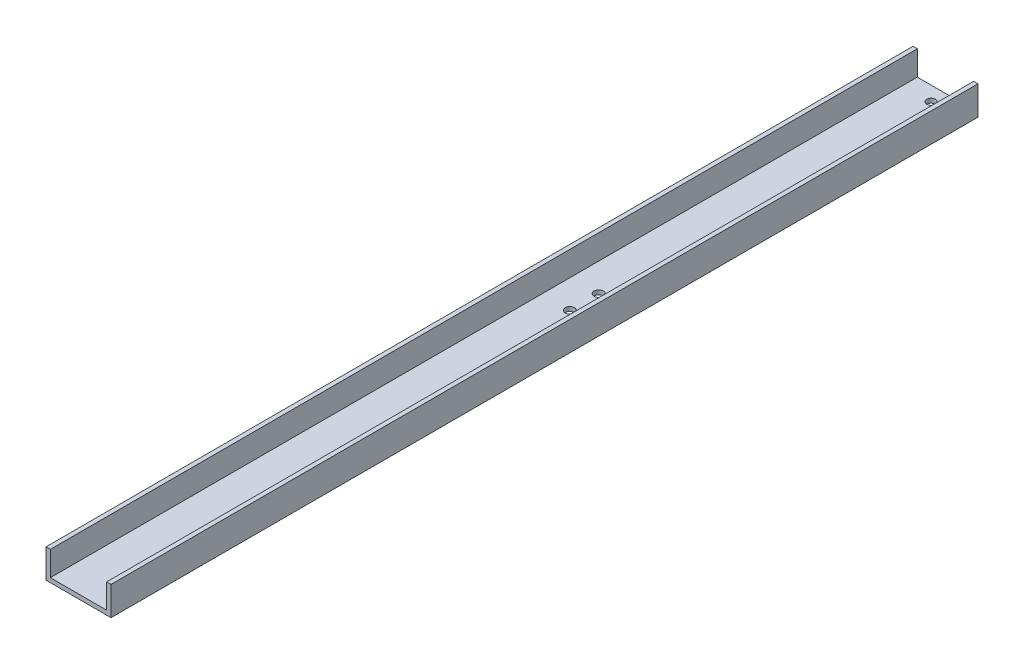
ISO-10303-21;
HEADER;
FILE_DESCRIPTION(('STEP AP214'),'2;1');
FILE_NAME('part.step','',(''),(''),'','','');
FILE_SCHEMA(('AUTOMOTIVE_DESIGN { 1 0 10303 214 1 1 1 1 }'));
ENDSEC;
DATA;
#1=APPLICATION_CONTEXT('core data for automotive mechanical design processes');
#2=APPLICATION_PROTOCOL_DEFINITION('international standard','automotive_design',2000,#1);
#3=PRODUCT_CONTEXT('',#1,'mechanical');
#4=PRODUCT('Part','Part','',(#3));
#5=PRODUCT_RELATED_PRODUCT_CATEGORY('part','',(#4));
#6=PRODUCT_DEFINITION_FORMATION('','',#4);
#7=PRODUCT_DEFINITION_CONTEXT('part definition',#1,'design');
#8=PRODUCT_DEFINITION('design','',#6,#7);
#9=PRODUCT_DEFINITION_SHAPE('','',#8);
#10=(LENGTH_UNIT() NAMED_UNIT(*) SI_UNIT(.MILLI.,.METRE.));
#11=(NAMED_UNIT(*) PLANE_ANGLE_UNIT() SI_UNIT($,.RADIAN.));
#12=(NAMED_UNIT(*) SI_UNIT($,.STERADIAN.) SOLID_ANGLE_UNIT());
#13=UNCERTAINTY_MEASURE_WITH_UNIT(LENGTH_MEASURE(1.E-05),#10,'distance_accuracy_value','');
#14=(GEOMETRIC_REPRESENTATION_CONTEXT(3) GLOBAL_UNCERTAINTY_ASSIGNED_CONTEXT((#13)) GLOBAL_UNIT_ASSIGNED_CONTEXT((#10,
#11,#12)) REPRESENTATION_CONTEXT('',''));
#15=CARTESIAN_POINT('',(0.,0.,0.));
#16=DIRECTION('',(0.,0.,1.));
#17=DIRECTION('',(1.,0.,0.));
#18=AXIS2_PLACEMENT_3D('',#15,#16,#17);
#19=CARTESIAN_POINT('',(-11.25,10.,300.));
#20=DIRECTION('',(1.,0.,0.));
#21=DIRECTION('',(0.,1.,0.));
#22=AXIS2_PLACEMENT_3D('',#19,#20,#21);
#23=PLANE('',#22);
#24=DIRECTION('',(0.,-1.,0.));
#25=VECTOR('',#24,1.);
#26=CARTESIAN_POINT('',(-11.25,10.,0.));
#27=LINE('',#26,#25);
#28=CARTESIAN_POINT('',(-11.25,10.,0.));
#29=VERTEX_POINT('',#28);
#30=CARTESIAN_POINT('',(-11.25,0.,0.));
#31=VERTEX_POINT('',#30);
#32=EDGE_CURVE('E132',#29,#31,#27,.T.);
#33=ORIENTED_EDGE('',*,*,#32,.T.);
#34=DIRECTION('',(0.,0.,-1.));
#35=VECTOR('',#34,1.);
#36=CARTESIAN_POINT('',(-11.25,0.,300.));
#37=LINE('',#36,#35);
#38=CARTESIAN_POINT('',(-11.25,0.,300.));
#39=VERTEX_POINT('',#38);
#40=EDGE_CURVE('E11',#39,#31,#37,.T.);
#41=ORIENTED_EDGE('',*,*,#40,.F.);
#42=DIRECTION('',(0.,-1.,0.));
#43=VECTOR('',#42,1.);
#44=CARTESIAN_POINT('',(-11.25,10.,300.));
#45=LINE('',#44,#43);
#46=CARTESIAN_POINT('',(-11.25,10.,300.));
#47=VERTEX_POINT('',#46);
#48=EDGE_CURVE('E147',#47,#39,#45,.T.);
#49=ORIENTED_EDGE('',*,*,#48,.F.);
#50=DIRECTION('',(0.,0.,-1.));
#51=VECTOR('',#50,1.);
#52=CARTESIAN_POINT('',(-11.25,10.,300.));
#53=LINE('',#52,#51);
#54=EDGE_CURVE('E128',#47,#29,#53,.T.);
#55=ORIENTED_EDGE('',*,*,#54,.T.);
#56=EDGE_LOOP('',(#33,#41,#49,#55));
#57=FACE_BOUND('',#56,.T.);
#58=ADVANCED_FACE('F34',(#57),#23,.F.);
#59=CARTESIAN_POINT('',(-11.25,0.,300.));
#60=DIRECTION('',(0.,1.,0.));
#61=DIRECTION('',(0.,0.,1.));
#62=AXIS2_PLACEMENT_3D('',#59,#60,#61);
#63=PLANE('',#62);
#64=CARTESIAN_POINT('',(0.,0.,5.));
#65=DIRECTION('',(0.,-1.,0.));
#66=DIRECTION('',(0.,0.,-1.));
#67=AXIS2_PLACEMENT_3D('',#64,#65,#66);
#68=CIRCLE('',#67,1.49999999999999);
#69=CARTESIAN_POINT('',(0.,0.,3.50000000000001));
#70=VERTEX_POINT('',#69);
#71=EDGE_CURVE('E316',#70,#70,#68,.T.);
#72=ORIENTED_EDGE('',*,*,#71,.F.);
#73=EDGE_LOOP('',(#72));
#74=FACE_BOUND('',#73,.T.);
#75=CARTESIAN_POINT('',(0.,0.,130.));
#76=DIRECTION('',(0.,-1.,0.));
#77=DIRECTION('',(0.,0.,-1.));
#78=AXIS2_PLACEMENT_3D('',#75,#76,#77);
#79=CIRCLE('',#78,1.6);
#80=CARTESIAN_POINT('',(0.,0.,128.4));
#81=VERTEX_POINT('',#80);
#82=EDGE_CURVE('E167',#81,#81,#79,.T.);
#83=ORIENTED_EDGE('',*,*,#82,.F.);
#84=EDGE_LOOP('',(#83));
#85=FACE_BOUND('',#84,.T.);
#86=CARTESIAN_POINT('',(0.,0.,120.));
#87=DIRECTION('',(0.,-1.,0.));
#88=DIRECTION('',(0.,0.,-1.));
#89=AXIS2_PLACEMENT_3D('',#86,#87,#88);
#90=CIRCLE('',#89,1.6);
#91=CARTESIAN_POINT('',(0.,0.,118.4));
#92=VERTEX_POINT('',#91);
#93=EDGE_CURVE('E159',#92,#92,#90,.T.);
#94=ORIENTED_EDGE('',*,*,#93,.F.);
#95=EDGE_LOOP('',(#94));
#96=FACE_BOUND('',#95,.T.);
#97=DIRECTION('',(1.,0.,0.));
#98=VECTOR('',#97,1.);
#99=CARTESIAN_POINT('',(-11.25,0.,0.));
#100=LINE('',#99,#98);
#101=CARTESIAN_POINT('',(11.25,0.,0.));
#102=VERTEX_POINT('',#101);
#103=EDGE_CURVE('E135',#31,#102,#100,.T.);
#104=ORIENTED_EDGE('',*,*,#103,.T.);
#105=DIRECTION('',(0.,0.,-1.));
#106=VECTOR('',#105,1.);
#107=CARTESIAN_POINT('',(11.25,0.,300.));
#108=LINE('',#107,#106);
#109=CARTESIAN_POINT('',(11.25,0.,300.));
#110=VERTEX_POINT('',#109);
#111=EDGE_CURVE('E43',#110,#102,#108,.T.);
#112=ORIENTED_EDGE('',*,*,#111,.F.);
#113=DIRECTION('',(1.,0.,0.));
#114=VECTOR('',#113,1.);
#115=CARTESIAN_POINT('',(-11.25,0.,300.));
#116=LINE('',#115,#114);
#117=EDGE_CURVE('E95',#39,#110,#116,.T.);
#118=ORIENTED_EDGE('',*,*,#117,.F.);
#119=ORIENTED_EDGE('',*,*,#40,.T.);
#120=EDGE_LOOP('',(#104,#112,#118,#119));
#121=FACE_BOUND('',#120,.T.);
#122=ADVANCED_FACE('F204',(#74,#85,#96,#121),#63,.F.);
#123=CARTESIAN_POINT('',(11.25,0.,300.));
#124=DIRECTION('',(-1.,0.,0.));
#125=DIRECTION('',(0.,-1.,0.));
#126=AXIS2_PLACEMENT_3D('',#123,#124,#125);
#127=PLANE('',#126);
#128=DIRECTION('',(0.,1.,0.));
#129=VECTOR('',#128,1.);
#130=CARTESIAN_POINT('',(11.25,0.,0.));
#131=LINE('',#130,#129);
#132=CARTESIAN_POINT('',(11.25,10.,0.));
#133=VERTEX_POINT('',#132);
#134=EDGE_CURVE('E138',#102,#133,#131,.T.);
#135=ORIENTED_EDGE('',*,*,#134,.T.);
#136=DIRECTION('',(0.,0.,-1.));
#137=VECTOR('',#136,1.);
#138=CARTESIAN_POINT('',(11.25,10.,300.));
#139=LINE('',#138,#137);
#140=CARTESIAN_POINT('',(11.25,10.,300.));
#141=VERTEX_POINT('',#140);
#142=EDGE_CURVE('E154',#141,#133,#139,.T.);
#143=ORIENTED_EDGE('',*,*,#142,.F.);
#144=DIRECTION('',(0.,1.,0.));
#145=VECTOR('',#144,1.);
#146=CARTESIAN_POINT('',(11.25,0.,300.));
#147=LINE('',#146,#145);
#148=EDGE_CURVE('E173',#110,#141,#147,.T.);
#149=ORIENTED_EDGE('',*,*,#148,.F.);
#150=ORIENTED_EDGE('',*,*,#111,.T.);
#151=EDGE_LOOP('',(#135,#143,#149,#150));
#152=FACE_BOUND('',#151,.T.);
#153=ADVANCED_FACE('F208',(#152),#127,.F.);
#154=CARTESIAN_POINT('',(11.25,10.,300.));
#155=DIRECTION('',(0.,-1.,0.));
#156=DIRECTION('',(0.,0.,-1.));
#157=AXIS2_PLACEMENT_3D('',#154,#155,#156);
#158=PLANE('',#157);
#159=DIRECTION('',(-1.,0.,0.));
#160=VECTOR('',#159,1.);
#161=CARTESIAN_POINT('',(11.25,10.,0.));
#162=LINE('',#161,#160);
#163=CARTESIAN_POINT('',(9.75,10.,0.));
#164=VERTEX_POINT('',#163);
#165=EDGE_CURVE('E140',#133,#164,#162,.T.);
#166=ORIENTED_EDGE('',*,*,#165,.T.);
#167=DIRECTION('',(0.,0.,-1.));
#168=VECTOR('',#167,1.);
#169=CARTESIAN_POINT('',(9.75,10.,300.));
#170=LINE('',#169,#168);
#171=CARTESIAN_POINT('',(9.75,10.,300.));
#172=VERTEX_POINT('',#171);
#173=EDGE_CURVE('E151',#172,#164,#170,.T.);
#174=ORIENTED_EDGE('',*,*,#173,.F.);
#175=DIRECTION('',(-1.,0.,0.));
#176=VECTOR('',#175,1.);
#177=CARTESIAN_POINT('',(11.25,10.,300.));
#178=LINE('',#177,#176);
#179=EDGE_CURVE('E175',#141,#172,#178,.T.);
#180=ORIENTED_EDGE('',*,*,#179,.F.);
#181=ORIENTED_EDGE('',*,*,#142,.T.);
#182=EDGE_LOOP('',(#166,#174,#180,#181));
#183=FACE_BOUND('',#182,.T.);
#184=ADVANCED_FACE('F181',(#183),#158,.F.);
#185=CARTESIAN_POINT('',(9.75,10.,300.));
#186=DIRECTION('',(1.,0.,0.));
#187=DIRECTION('',(0.,0.,-1.));
#188=AXIS2_PLACEMENT_3D('',#185,#186,#187);
#189=PLANE('',#188);
#190=DIRECTION('',(0.,-1.,0.));
#191=VECTOR('',#190,1.);
#192=CARTESIAN_POINT('',(9.75,10.,0.));
#193=LINE('',#192,#191);
#194=CARTESIAN_POINT('',(9.75,1.5,0.));
#195=VERTEX_POINT('',#194);
#196=EDGE_CURVE('E142',#164,#195,#193,.T.);
#197=ORIENTED_EDGE('',*,*,#196,.T.);
#198=DIRECTION('',(0.,0.,-1.));
#199=VECTOR('',#198,1.);
#200=CARTESIAN_POINT('',(9.75,1.5,300.));
#201=LINE('',#200,#199);
#202=CARTESIAN_POINT('',(9.75,1.5,300.));
#203=VERTEX_POINT('',#202);
#204=EDGE_CURVE('E123',#203,#195,#201,.T.);
#205=ORIENTED_EDGE('',*,*,#204,.F.);
#206=DIRECTION('',(0.,-1.,0.));
#207=VECTOR('',#206,1.);
#208=CARTESIAN_POINT('',(9.75,10.,300.));
#209=LINE('',#208,#207);
#210=EDGE_CURVE('E114',#172,#203,#209,.T.);
#211=ORIENTED_EDGE('',*,*,#210,.F.);
#212=ORIENTED_EDGE('',*,*,#173,.T.);
#213=EDGE_LOOP('',(#197,#205,#211,#212));
#214=FACE_BOUND('',#213,.T.);
#215=ADVANCED_FACE('F185',(#214),#189,.F.);
#216=CARTESIAN_POINT('',(9.75,1.5,300.));
#217=DIRECTION('',(0.,-1.,0.));
#218=DIRECTION('',(0.,0.,-1.));
#219=AXIS2_PLACEMENT_3D('',#216,#217,#218);
#220=PLANE('',#219);
#221=CARTESIAN_POINT('',(0.,1.5,5.));
#222=DIRECTION('',(0.,-1.,0.));
#223=DIRECTION('',(0.,0.,-1.));
#224=AXIS2_PLACEMENT_3D('',#221,#222,#223);
#225=CIRCLE('',#224,1.49999999999999);
#226=CARTESIAN_POINT('',(0.,1.5,3.50000000000001));
#227=VERTEX_POINT('',#226);
#228=EDGE_CURVE('E229',#227,#227,#225,.T.);
#229=ORIENTED_EDGE('',*,*,#228,.T.);
#230=EDGE_LOOP('',(#229));
#231=FACE_BOUND('',#230,.T.);
#232=CARTESIAN_POINT('',(0.,1.5,130.));
#233=DIRECTION('',(0.,-1.,0.));
#234=DIRECTION('',(0.,0.,-1.));
#235=AXIS2_PLACEMENT_3D('',#232,#233,#234);
#236=CIRCLE('',#235,1.6);
#237=CARTESIAN_POINT('',(0.,1.5,128.4));
#238=VERTEX_POINT('',#237);
#239=EDGE_CURVE('E37',#238,#238,#236,.T.);
#240=ORIENTED_EDGE('',*,*,#239,.T.);
#241=EDGE_LOOP('',(#240));
#242=FACE_BOUND('',#241,.T.);
#243=CARTESIAN_POINT('',(0.,1.5,120.));
#244=DIRECTION('',(0.,-1.,0.));
#245=DIRECTION('',(0.,0.,-1.));
#246=AXIS2_PLACEMENT_3D('',#243,#244,#245);
#247=CIRCLE('',#246,1.6);
#248=CARTESIAN_POINT('',(0.,1.5,118.4));
#249=VERTEX_POINT('',#248);
#250=EDGE_CURVE('E136',#249,#249,#247,.T.);
#251=ORIENTED_EDGE('',*,*,#250,.T.);
#252=EDGE_LOOP('',(#251));
#253=FACE_BOUND('',#252,.T.);
#254=DIRECTION('',(-1.,0.,0.));
#255=VECTOR('',#254,1.);
#256=CARTESIAN_POINT('',(9.75,1.5,0.));
#257=LINE('',#256,#255);
#258=CARTESIAN_POINT('',(-9.75,1.5,0.));
#259=VERTEX_POINT('',#258);
#260=EDGE_CURVE('E122',#195,#259,#257,.T.);
#261=ORIENTED_EDGE('',*,*,#260,.T.);
#262=DIRECTION('',(0.,0.,-1.));
#263=VECTOR('',#262,1.);
#264=CARTESIAN_POINT('',(-9.75,1.5,300.));
#265=LINE('',#264,#263);
#266=CARTESIAN_POINT('',(-9.75,1.5,300.));
#267=VERTEX_POINT('',#266);
#268=EDGE_CURVE('E119',#267,#259,#265,.T.);
#269=ORIENTED_EDGE('',*,*,#268,.F.);
#270=DIRECTION('',(-1.,0.,0.));
#271=VECTOR('',#270,1.);
#272=CARTESIAN_POINT('',(9.75,1.5,300.));
#273=LINE('',#272,#271);
#274=EDGE_CURVE('E108',#203,#267,#273,.T.);
#275=ORIENTED_EDGE('',*,*,#274,.F.);
#276=ORIENTED_EDGE('',*,*,#204,.T.);
#277=EDGE_LOOP('',(#261,#269,#275,#276));
#278=FACE_BOUND('',#277,.T.);
#279=ADVANCED_FACE('F120',(#231,#242,#253,#278),#220,.F.);
#280=CARTESIAN_POINT('',(-9.75,1.5,300.));
#281=DIRECTION('',(-1.,0.,0.));
#282=DIRECTION('',(0.,0.,1.));
#283=AXIS2_PLACEMENT_3D('',#280,#281,#282);
#284=PLANE('',#283);
#285=DIRECTION('',(0.,1.,0.));
#286=VECTOR('',#285,1.);
#287=CARTESIAN_POINT('',(-9.75,1.5,0.));
#288=LINE('',#287,#286);
#289=CARTESIAN_POINT('',(-9.75,10.,0.));
#290=VERTEX_POINT('',#289);
#291=EDGE_CURVE('E81',#259,#290,#288,.T.);
#292=ORIENTED_EDGE('',*,*,#291,.T.);
#293=DIRECTION('',(0.,0.,-1.));
#294=VECTOR('',#293,1.);
#295=CARTESIAN_POINT('',(-9.75,10.,300.));
#296=LINE('',#295,#294);
#297=CARTESIAN_POINT('',(-9.75,10.,300.));
#298=VERTEX_POINT('',#297);
#299=EDGE_CURVE('E124',#298,#290,#296,.T.);
#300=ORIENTED_EDGE('',*,*,#299,.F.);
#301=DIRECTION('',(0.,1.,0.));
#302=VECTOR('',#301,1.);
#303=CARTESIAN_POINT('',(-9.75,1.5,300.));
#304=LINE('',#303,#302);
#305=EDGE_CURVE('E112',#267,#298,#304,.T.);
#306=ORIENTED_EDGE('',*,*,#305,.F.);
#307=ORIENTED_EDGE('',*,*,#268,.T.);
#308=EDGE_LOOP('',(#292,#300,#306,#307));
#309=FACE_BOUND('',#308,.T.);
#310=ADVANCED_FACE('F126',(#309),#284,.F.);
#311=CARTESIAN_POINT('',(-9.75,10.,300.));
#312=DIRECTION('',(0.,-1.,0.));
#313=DIRECTION('',(0.,0.,-1.));
#314=AXIS2_PLACEMENT_3D('',#311,#312,#313);
#315=PLANE('',#314);
#316=DIRECTION('',(-1.,0.,0.));
#317=VECTOR('',#316,1.);
#318=CARTESIAN_POINT('',(-9.75,10.,0.));
#319=LINE('',#318,#317);
#320=EDGE_CURVE('E87',#290,#29,#319,.T.);
#321=ORIENTED_EDGE('',*,*,#320,.T.);
#322=ORIENTED_EDGE('',*,*,#54,.F.);
#323=DIRECTION('',(-1.,0.,0.));
#324=VECTOR('',#323,1.);
#325=CARTESIAN_POINT('',(-9.75,10.,300.));
#326=LINE('',#325,#324);
#327=EDGE_CURVE('E52',#298,#47,#326,.T.);
#328=ORIENTED_EDGE('',*,*,#327,.F.);
#329=ORIENTED_EDGE('',*,*,#299,.T.);
#330=EDGE_LOOP('',(#321,#322,#328,#329));
#331=FACE_BOUND('',#330,.T.);
#332=ADVANCED_FACE('F193',(#331),#315,.F.);
#333=CARTESIAN_POINT('',(0.,0.,300.));
#334=DIRECTION('',(0.,0.,1.));
#335=DIRECTION('',(1.,0.,0.));
#336=AXIS2_PLACEMENT_3D('',#333,#334,#335);
#337=PLANE('',#336);
#338=ORIENTED_EDGE('',*,*,#48,.T.);
#339=ORIENTED_EDGE('',*,*,#117,.T.);
#340=ORIENTED_EDGE('',*,*,#148,.T.);
#341=ORIENTED_EDGE('',*,*,#179,.T.);
#342=ORIENTED_EDGE('',*,*,#210,.T.);
#343=ORIENTED_EDGE('',*,*,#274,.T.);
#344=ORIENTED_EDGE('',*,*,#305,.T.);
#345=ORIENTED_EDGE('',*,*,#327,.T.);
#346=EDGE_LOOP('',(#338,#339,#340,#341,#342,#343,#344,#345));
#347=FACE_BOUND('',#346,.T.);
#348=ADVANCED_FACE('F110',(#347),#337,.T.);
#349=CARTESIAN_POINT('',(0.,0.,0.));
#350=DIRECTION('',(0.,0.,1.));
#351=DIRECTION('',(1.,0.,0.));
#352=AXIS2_PLACEMENT_3D('',#349,#350,#351);
#353=PLANE('',#352);
#354=ORIENTED_EDGE('',*,*,#32,.F.);
#355=ORIENTED_EDGE('',*,*,#320,.F.);
#356=ORIENTED_EDGE('',*,*,#291,.F.);
#357=ORIENTED_EDGE('',*,*,#260,.F.);
#358=ORIENTED_EDGE('',*,*,#196,.F.);
#359=ORIENTED_EDGE('',*,*,#165,.F.);
#360=ORIENTED_EDGE('',*,*,#134,.F.);
#361=ORIENTED_EDGE('',*,*,#103,.F.);
#362=EDGE_LOOP('',(#354,#355,#356,#357,#358,#359,#360,#361));
#363=FACE_BOUND('',#362,.T.);
#364=ADVANCED_FACE('F188',(#363),#353,.F.);
#365=CARTESIAN_POINT('',(0.,10.,120.));
#366=DIRECTION('',(0.,-1.,0.));
#367=DIRECTION('',(0.,0.,-1.));
#368=AXIS2_PLACEMENT_3D('',#365,#366,#367);
#369=CYLINDRICAL_SURFACE('',#368,1.6);
#370=ORIENTED_EDGE('',*,*,#93,.T.);
#371=EDGE_LOOP('',(#370));
#372=FACE_BOUND('',#371,.T.);
#373=ORIENTED_EDGE('',*,*,#250,.F.);
#374=EDGE_LOOP('',(#373));
#375=FACE_BOUND('',#374,.T.);
#376=ADVANCED_FACE('F235',(#372,#375),#369,.F.);
#377=CARTESIAN_POINT('',(0.,10.,130.));
#378=DIRECTION('',(0.,-1.,0.));
#379=DIRECTION('',(0.,0.,-1.));
#380=AXIS2_PLACEMENT_3D('',#377,#378,#379);
#381=CYLINDRICAL_SURFACE('',#380,1.6);
#382=ORIENTED_EDGE('',*,*,#82,.T.);
#383=EDGE_LOOP('',(#382));
#384=FACE_BOUND('',#383,.T.);
#385=ORIENTED_EDGE('',*,*,#239,.F.);
#386=EDGE_LOOP('',(#385));
#387=FACE_BOUND('',#386,.T.);
#388=ADVANCED_FACE('F232',(#384,#387),#381,.F.);
#389=CARTESIAN_POINT('',(0.,0.,5.));
#390=DIRECTION('',(0.,-1.,0.));
#391=DIRECTION('',(0.,0.,-1.));
#392=AXIS2_PLACEMENT_3D('',#389,#390,#391);
#393=CYLINDRICAL_SURFACE('',#392,1.49999999999999);
#394=ORIENTED_EDGE('',*,*,#71,.T.);
#395=EDGE_LOOP('',(#394));
#396=FACE_BOUND('',#395,.T.);
#397=ORIENTED_EDGE('',*,*,#228,.F.);
#398=EDGE_LOOP('',(#397));
#399=FACE_BOUND('',#398,.T.);
#400=ADVANCED_FACE('F234',(#396,#399),#393,.F.);
#401=CLOSED_SHELL('',(#58,#122,#153,#184,#215,#279,#310,#332,#348,#364,#376,#388,#400));
#402=MANIFOLD_SOLID_BREP('B2',#401);
#403=ADVANCED_BREP_SHAPE_REPRESENTATION('',(#18,#402),#14);
#404=SHAPE_DEFINITION_REPRESENTATION(#9,#403);
ENDSEC;
END-ISO-10303-21;
